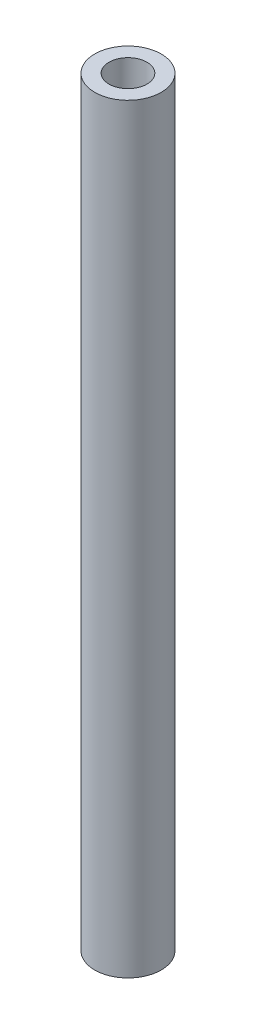
ISO-10303-21;
HEADER;
FILE_DESCRIPTION(('STEP AP214'),'2;1');
FILE_NAME('part.step','',(''),(''),'','','');
FILE_SCHEMA(('AUTOMOTIVE_DESIGN { 1 0 10303 214 1 1 1 1 }'));
ENDSEC;
DATA;
#1=APPLICATION_CONTEXT('core data for automotive mechanical design processes');
#2=APPLICATION_PROTOCOL_DEFINITION('international standard','automotive_design',2000,#1);
#3=PRODUCT_CONTEXT('',#1,'mechanical');
#4=PRODUCT('Part','Part','',(#3));
#5=PRODUCT_RELATED_PRODUCT_CATEGORY('part','',(#4));
#6=PRODUCT_DEFINITION_FORMATION('','',#4);
#7=PRODUCT_DEFINITION_CONTEXT('part definition',#1,'design');
#8=PRODUCT_DEFINITION('design','',#6,#7);
#9=PRODUCT_DEFINITION_SHAPE('','',#8);
#10=(LENGTH_UNIT() NAMED_UNIT(*) SI_UNIT(.MILLI.,.METRE.));
#11=(NAMED_UNIT(*) PLANE_ANGLE_UNIT() SI_UNIT($,.RADIAN.));
#12=(NAMED_UNIT(*) SI_UNIT($,.STERADIAN.) SOLID_ANGLE_UNIT());
#13=UNCERTAINTY_MEASURE_WITH_UNIT(LENGTH_MEASURE(1.E-05),#10,'distance_accuracy_value','');
#14=(GEOMETRIC_REPRESENTATION_CONTEXT(3) GLOBAL_UNCERTAINTY_ASSIGNED_CONTEXT((#13)) GLOBAL_UNIT_ASSIGNED_CONTEXT((#10,
#11,#12)) REPRESENTATION_CONTEXT('',''));
#15=CARTESIAN_POINT('',(0.,0.,0.));
#16=DIRECTION('',(0.,0.,1.));
#17=DIRECTION('',(1.,0.,0.));
#18=AXIS2_PLACEMENT_3D('',#15,#16,#17);
#19=CARTESIAN_POINT('',(0.,40.,0.));
#20=DIRECTION('',(0.,1.,0.));
#21=DIRECTION('',(0.,0.,1.));
#22=AXIS2_PLACEMENT_3D('',#19,#20,#21);
#23=PLANE('',#22);
#24=CARTESIAN_POINT('',(0.,40.,0.));
#25=DIRECTION('',(0.,1.,0.));
#26=DIRECTION('',(0.,0.,1.));
#27=AXIS2_PLACEMENT_3D('',#24,#25,#26);
#28=CIRCLE('',#27,1.75);
#29=CARTESIAN_POINT('',(0.,40.,1.75));
#30=VERTEX_POINT('',#29);
#31=EDGE_CURVE('E10',#30,#30,#28,.T.);
#32=ORIENTED_EDGE('',*,*,#31,.T.);
#33=EDGE_LOOP('',(#32));
#34=FACE_BOUND('',#33,.T.);
#35=CARTESIAN_POINT('',(0.,40.,0.));
#36=DIRECTION('',(0.,1.,0.));
#37=DIRECTION('',(0.,0.,1.));
#38=AXIS2_PLACEMENT_3D('',#35,#36,#37);
#39=CIRCLE('',#38,1.);
#40=CARTESIAN_POINT('',(0.,40.,1.));
#41=VERTEX_POINT('',#40);
#42=EDGE_CURVE('E54',#41,#41,#39,.T.);
#43=ORIENTED_EDGE('',*,*,#42,.F.);
#44=EDGE_LOOP('',(#43));
#45=FACE_BOUND('',#44,.T.);
#46=ADVANCED_FACE('F41',(#34,#45),#23,.T.);
#47=CARTESIAN_POINT('',(0.,0.,0.));
#48=DIRECTION('',(0.,1.,0.));
#49=DIRECTION('',(0.,0.,1.));
#50=AXIS2_PLACEMENT_3D('',#47,#48,#49);
#51=PLANE('',#50);
#52=CARTESIAN_POINT('',(0.,0.,0.));
#53=DIRECTION('',(0.,1.,0.));
#54=DIRECTION('',(0.,0.,1.));
#55=AXIS2_PLACEMENT_3D('',#52,#53,#54);
#56=CIRCLE('',#55,1.75);
#57=CARTESIAN_POINT('',(0.,0.,1.75));
#58=VERTEX_POINT('',#57);
#59=EDGE_CURVE('E45',#58,#58,#56,.T.);
#60=ORIENTED_EDGE('',*,*,#59,.F.);
#61=EDGE_LOOP('',(#60));
#62=FACE_BOUND('',#61,.T.);
#63=CARTESIAN_POINT('',(0.,0.,0.));
#64=DIRECTION('',(0.,1.,0.));
#65=DIRECTION('',(0.,0.,1.));
#66=AXIS2_PLACEMENT_3D('',#63,#64,#65);
#67=CIRCLE('',#66,1.);
#68=CARTESIAN_POINT('',(0.,0.,1.));
#69=VERTEX_POINT('',#68);
#70=EDGE_CURVE('E56',#69,#69,#67,.T.);
#71=ORIENTED_EDGE('',*,*,#70,.T.);
#72=EDGE_LOOP('',(#71));
#73=FACE_BOUND('',#72,.T.);
#74=ADVANCED_FACE('F68',(#62,#73),#51,.F.);
#75=CARTESIAN_POINT('',(0.,40.,0.));
#76=DIRECTION('',(0.,-1.,0.));
#77=DIRECTION('',(0.,0.,-1.));
#78=AXIS2_PLACEMENT_3D('',#75,#76,#77);
#79=CYLINDRICAL_SURFACE('',#78,1.75);
#80=ORIENTED_EDGE('',*,*,#31,.F.);
#81=EDGE_LOOP('',(#80));
#82=FACE_BOUND('',#81,.T.);
#83=ORIENTED_EDGE('',*,*,#59,.T.);
#84=EDGE_LOOP('',(#83));
#85=FACE_BOUND('',#84,.T.);
#86=ADVANCED_FACE('F43',(#82,#85),#79,.T.);
#87=CARTESIAN_POINT('',(0.,40.,0.));
#88=DIRECTION('',(0.,-1.,0.));
#89=DIRECTION('',(0.,0.,-1.));
#90=AXIS2_PLACEMENT_3D('',#87,#88,#89);
#91=CYLINDRICAL_SURFACE('',#90,1.);
#92=ORIENTED_EDGE('',*,*,#42,.T.);
#93=EDGE_LOOP('',(#92));
#94=FACE_BOUND('',#93,.T.);
#95=ORIENTED_EDGE('',*,*,#70,.F.);
#96=EDGE_LOOP('',(#95));
#97=FACE_BOUND('',#96,.T.);
#98=ADVANCED_FACE('F64',(#94,#97),#91,.F.);
#99=CLOSED_SHELL('',(#46,#74,#86,#98));
#100=MANIFOLD_SOLID_BREP('B2',#99);
#101=ADVANCED_BREP_SHAPE_REPRESENTATION('',(#18,#100),#14);
#102=SHAPE_DEFINITION_REPRESENTATION(#9,#101);
ENDSEC;
END-ISO-10303-21;
